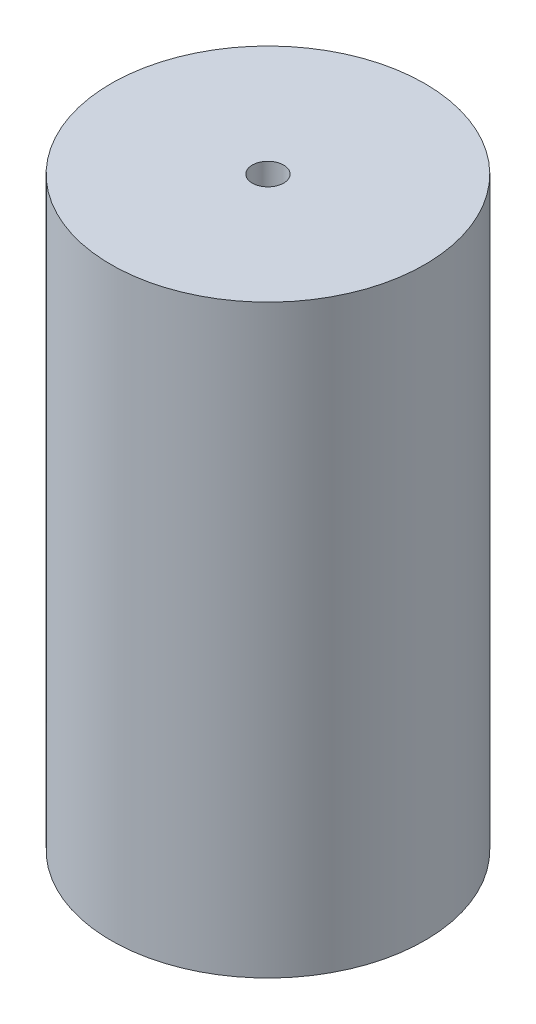
ISO-10303-21;
HEADER;
FILE_DESCRIPTION(('STEP AP214'),'2;1');
FILE_NAME('part.step','',(''),(''),'','','');
FILE_SCHEMA(('AUTOMOTIVE_DESIGN { 1 0 10303 214 1 1 1 1 }'));
ENDSEC;
DATA;
#1=APPLICATION_CONTEXT('core data for automotive mechanical design processes');
#2=APPLICATION_PROTOCOL_DEFINITION('international standard','automotive_design',2000,#1);
#3=PRODUCT_CONTEXT('',#1,'mechanical');
#4=PRODUCT('Part','Part','',(#3));
#5=PRODUCT_RELATED_PRODUCT_CATEGORY('part','',(#4));
#6=PRODUCT_DEFINITION_FORMATION('','',#4);
#7=PRODUCT_DEFINITION_CONTEXT('part definition',#1,'design');
#8=PRODUCT_DEFINITION('design','',#6,#7);
#9=PRODUCT_DEFINITION_SHAPE('','',#8);
#10=(LENGTH_UNIT() NAMED_UNIT(*) SI_UNIT(.MILLI.,.METRE.));
#11=(NAMED_UNIT(*) PLANE_ANGLE_UNIT() SI_UNIT($,.RADIAN.));
#12=(NAMED_UNIT(*) SI_UNIT($,.STERADIAN.) SOLID_ANGLE_UNIT());
#13=UNCERTAINTY_MEASURE_WITH_UNIT(LENGTH_MEASURE(1.E-05),#10,'distance_accuracy_value','');
#14=(GEOMETRIC_REPRESENTATION_CONTEXT(3) GLOBAL_UNCERTAINTY_ASSIGNED_CONTEXT((#13)) GLOBAL_UNIT_ASSIGNED_CONTEXT((#10,
#11,#12)) REPRESENTATION_CONTEXT('',''));
#15=CARTESIAN_POINT('',(0.,0.,0.));
#16=DIRECTION('',(0.,0.,1.));
#17=DIRECTION('',(1.,0.,0.));
#18=AXIS2_PLACEMENT_3D('',#15,#16,#17);
#19=CARTESIAN_POINT('',(0.,0.,0.));
#20=DIRECTION('',(0.,1.,0.));
#21=DIRECTION('',(0.,0.,1.));
#22=AXIS2_PLACEMENT_3D('',#19,#20,#21);
#23=PLANE('',#22);
#24=CARTESIAN_POINT('',(0.,0.,0.));
#25=DIRECTION('',(0.,1.,0.));
#26=DIRECTION('',(0.,0.,1.));
#27=AXIS2_PLACEMENT_3D('',#24,#25,#26);
#28=CIRCLE('',#27,21.717);
#29=CARTESIAN_POINT('',(0.,0.,21.717));
#30=VERTEX_POINT('',#29);
#31=EDGE_CURVE('E49',#30,#30,#28,.T.);
#32=ORIENTED_EDGE('',*,*,#31,.T.);
#33=EDGE_LOOP('',(#32));
#34=FACE_BOUND('',#33,.T.);
#35=CARTESIAN_POINT('',(0.,0.,0.));
#36=DIRECTION('',(0.,1.,0.));
#37=DIRECTION('',(0.,0.,1.));
#38=AXIS2_PLACEMENT_3D('',#35,#36,#37);
#39=CIRCLE('',#38,25.527);
#40=CARTESIAN_POINT('',(0.,0.,-25.527));
#41=VERTEX_POINT('',#40);
#42=EDGE_CURVE('E54',#41,#41,#39,.T.);
#43=ORIENTED_EDGE('',*,*,#42,.F.);
#44=EDGE_LOOP('',(#43));
#45=FACE_BOUND('',#44,.T.);
#46=ADVANCED_FACE('F41',(#34,#45),#23,.F.);
#47=CARTESIAN_POINT('',(0.,76.2,0.));
#48=DIRECTION('',(0.,-1.,0.));
#49=DIRECTION('',(0.,0.,-1.));
#50=AXIS2_PLACEMENT_3D('',#47,#48,#49);
#51=CYLINDRICAL_SURFACE('',#50,25.527);
#52=CARTESIAN_POINT('',(0.,95.25,0.));
#53=DIRECTION('',(0.,1.,0.));
#54=DIRECTION('',(0.,0.,1.));
#55=AXIS2_PLACEMENT_3D('',#52,#53,#54);
#56=CIRCLE('',#55,25.527);
#57=CARTESIAN_POINT('',(0.,95.25,-25.527));
#58=VERTEX_POINT('',#57);
#59=EDGE_CURVE('E65',#58,#58,#56,.T.);
#60=CARTESIAN_POINT('',(0.,0.,-25.527));
#61=CARTESIAN_POINT('',(0.,0.992187500000001,-25.527));
#62=CARTESIAN_POINT('',(0.,1.984375,-25.527));
#63=CARTESIAN_POINT('',(0.,3.96875,-25.527));
#64=CARTESIAN_POINT('',(0.,4.9609375,-25.527));
#65=CARTESIAN_POINT('',(0.,6.9453125,-25.527));
#66=CARTESIAN_POINT('',(0.,7.93750000000001,-25.527));
#67=CARTESIAN_POINT('',(0.,9.92187500000001,-25.527));
#68=CARTESIAN_POINT('',(0.,10.9140625,-25.527));
#69=CARTESIAN_POINT('',(0.,12.8984375,-25.527));
#70=CARTESIAN_POINT('',(0.,13.890625,-25.527));
#71=CARTESIAN_POINT('',(0.,15.875,-25.527));
#72=CARTESIAN_POINT('',(0.,16.8671875,-25.527));
#73=CARTESIAN_POINT('',(0.,18.8515625,-25.527));
#74=CARTESIAN_POINT('',(0.,19.84375,-25.527));
#75=CARTESIAN_POINT('',(0.,21.828125,-25.527));
#76=CARTESIAN_POINT('',(0.,22.8203125,-25.527));
#77=CARTESIAN_POINT('',(0.,24.8046875,-25.527));
#78=CARTESIAN_POINT('',(0.,25.796875,-25.527));
#79=CARTESIAN_POINT('',(0.,27.78125,-25.527));
#80=CARTESIAN_POINT('',(0.,28.7734375,-25.527));
#81=CARTESIAN_POINT('',(0.,30.7578125,-25.527));
#82=CARTESIAN_POINT('',(0.,31.75,-25.527));
#83=CARTESIAN_POINT('',(0.,33.734375,-25.527));
#84=CARTESIAN_POINT('',(0.,34.7265625,-25.527));
#85=CARTESIAN_POINT('',(0.,36.7109375,-25.527));
#86=CARTESIAN_POINT('',(0.,37.703125,-25.527));
#87=CARTESIAN_POINT('',(0.,39.6875,-25.527));
#88=CARTESIAN_POINT('',(0.,40.6796875,-25.527));
#89=CARTESIAN_POINT('',(0.,42.6640625,-25.527));
#90=CARTESIAN_POINT('',(0.,43.65625,-25.527));
#91=CARTESIAN_POINT('',(0.,45.640625,-25.527));
#92=CARTESIAN_POINT('',(0.,46.6328125,-25.527));
#93=CARTESIAN_POINT('',(0.,48.6171875,-25.527));
#94=CARTESIAN_POINT('',(0.,49.609375,-25.527));
#95=CARTESIAN_POINT('',(0.,51.59375,-25.527));
#96=CARTESIAN_POINT('',(0.,52.5859375,-25.527));
#97=CARTESIAN_POINT('',(0.,54.5703125,-25.527));
#98=CARTESIAN_POINT('',(0.,55.5625,-25.527));
#99=CARTESIAN_POINT('',(0.,57.546875,-25.527));
#100=CARTESIAN_POINT('',(0.,58.5390625,-25.527));
#101=CARTESIAN_POINT('',(0.,60.5234375,-25.527));
#102=CARTESIAN_POINT('',(0.,61.515625,-25.527));
#103=CARTESIAN_POINT('',(0.,63.5,-25.527));
#104=CARTESIAN_POINT('',(0.,64.4921875,-25.527));
#105=CARTESIAN_POINT('',(0.,66.4765625,-25.527));
#106=CARTESIAN_POINT('',(0.,67.46875,-25.527));
#107=CARTESIAN_POINT('',(0.,69.453125,-25.527));
#108=CARTESIAN_POINT('',(0.,70.4453125,-25.527));
#109=CARTESIAN_POINT('',(0.,72.4296875,-25.527));
#110=CARTESIAN_POINT('',(0.,73.421875,-25.527));
#111=CARTESIAN_POINT('',(0.,75.40625,-25.527));
#112=CARTESIAN_POINT('',(0.,76.3984375,-25.527));
#113=CARTESIAN_POINT('',(0.,78.3828125,-25.527));
#114=CARTESIAN_POINT('',(0.,79.375,-25.527));
#115=CARTESIAN_POINT('',(0.,81.359375,-25.527));
#116=CARTESIAN_POINT('',(0.,82.3515625,-25.527));
#117=CARTESIAN_POINT('',(0.,84.3359375,-25.527));
#118=CARTESIAN_POINT('',(0.,85.328125,-25.527));
#119=CARTESIAN_POINT('',(0.,87.3125,-25.527));
#120=CARTESIAN_POINT('',(0.,88.3046875,-25.527));
#121=CARTESIAN_POINT('',(0.,90.2890625,-25.527));
#122=CARTESIAN_POINT('',(0.,91.28125,-25.527));
#123=CARTESIAN_POINT('',(0.,93.265625,-25.527));
#124=CARTESIAN_POINT('',(0.,94.2578125,-25.527));
#125=CARTESIAN_POINT('',(0.,95.25,-25.527));
#126=B_SPLINE_CURVE_WITH_KNOTS('',3,(#60,#61,#62,#63,#64,#65,#66,#67,#68,#69,#70,#71,#72,#73,
#74,#75,#76,#77,#78,#79,#80,#81,#82,#83,#84,#85,#86,#87,#88,#89,#90,#91,#92,#93,#94,#95,#96,#97,
#98,#99,#100,#101,#102,#103,#104,#105,#106,#107,#108,#109,#110,#111,#112,#113,#114,#115,#116,
#117,#118,#119,#120,#121,#122,#123,#124,#125),.UNSPECIFIED.,.F.,.F.,(4,2,2,2,2,2,2,2,2,2,2,2,2,
2,2,2,2,2,2,2,2,2,2,2,2,2,2,2,2,2,2,2,4),(0.,2.9765625,5.953125,8.92968750000001,11.90625,
14.8828125,17.859375,20.8359375,23.8125,26.7890625,29.765625,32.7421875,35.71875,38.6953125,
41.671875,44.6484375,47.625,50.6015625,53.578125,56.5546875,59.53125,62.5078125,65.484375,
68.4609375,71.4375,74.4140625,77.390625,80.3671875,83.34375,86.3203125,89.296875,92.2734375,
95.25),.UNSPECIFIED.);
#127=EDGE_CURVE('BSEAM87',#41,#58,#126,.T.);
#128=ORIENTED_EDGE('',*,*,#42,.T.);
#129=ORIENTED_EDGE('',*,*,#59,.F.);
#130=ORIENTED_EDGE('',*,*,#127,.T.);
#131=ORIENTED_EDGE('',*,*,#127,.F.);
#132=EDGE_LOOP('',(#128,#130,#129,#131));
#133=FACE_BOUND('',#132,.T.);
#134=ADVANCED_FACE('F87',(#133),#51,.T.);
#135=CARTESIAN_POINT('',(0.,76.2,0.));
#136=DIRECTION('',(0.,-1.,0.));
#137=DIRECTION('',(0.,0.,-1.));
#138=AXIS2_PLACEMENT_3D('',#135,#136,#137);
#139=CYLINDRICAL_SURFACE('',#138,19.177);
#140=CARTESIAN_POINT('',(0.,2.54,0.));
#141=DIRECTION('',(0.,1.,0.));
#142=DIRECTION('',(0.,0.,1.));
#143=AXIS2_PLACEMENT_3D('',#140,#141,#142);
#144=CIRCLE('',#143,19.177);
#145=CARTESIAN_POINT('',(0.,2.53999999999999,-19.177));
#146=VERTEX_POINT('',#145);
#147=EDGE_CURVE('E10',#146,#146,#144,.F.);
#148=CARTESIAN_POINT('',(0.,76.2,0.));
#149=DIRECTION('',(0.,1.,0.));
#150=DIRECTION('',(0.,0.,1.));
#151=AXIS2_PLACEMENT_3D('',#148,#149,#150);
#152=CIRCLE('',#151,19.177);
#153=CARTESIAN_POINT('',(0.,76.2,-19.177));
#154=VERTEX_POINT('',#153);
#155=EDGE_CURVE('E59',#154,#154,#152,.T.);
#156=CARTESIAN_POINT('',(0.,2.53999999999999,-19.177));
#157=CARTESIAN_POINT('',(0.,3.30729166666665,-19.177));
#158=CARTESIAN_POINT('',(0.,4.07458333333332,-19.177));
#159=CARTESIAN_POINT('',(0.,5.60916666666665,-19.177));
#160=CARTESIAN_POINT('',(0.,6.37645833333332,-19.177));
#161=CARTESIAN_POINT('',(0.,7.91104166666666,-19.177));
#162=CARTESIAN_POINT('',(0.,8.67833333333332,-19.177));
#163=CARTESIAN_POINT('',(0.,10.2129166666667,-19.177));
#164=CARTESIAN_POINT('',(0.,10.9802083333333,-19.177));
#165=CARTESIAN_POINT('',(0.,12.5147916666667,-19.177));
#166=CARTESIAN_POINT('',(0.,13.2820833333333,-19.177));
#167=CARTESIAN_POINT('',(0.,14.8166666666667,-19.177));
#168=CARTESIAN_POINT('',(0.,15.5839583333333,-19.177));
#169=CARTESIAN_POINT('',(0.,17.1185416666667,-19.177));
#170=CARTESIAN_POINT('',(0.,17.8858333333333,-19.177));
#171=CARTESIAN_POINT('',(0.,19.4204166666667,-19.177));
#172=CARTESIAN_POINT('',(0.,20.1877083333333,-19.177));
#173=CARTESIAN_POINT('',(0.,21.7222916666666,-19.177));
#174=CARTESIAN_POINT('',(0.,22.4895833333333,-19.177));
#175=CARTESIAN_POINT('',(0.,24.0241666666667,-19.177));
#176=CARTESIAN_POINT('',(0.,24.7914583333333,-19.177));
#177=CARTESIAN_POINT('',(0.,26.3260416666667,-19.177));
#178=CARTESIAN_POINT('',(0.,27.0933333333333,-19.177));
#179=CARTESIAN_POINT('',(0.,28.6279166666667,-19.177));
#180=CARTESIAN_POINT('',(0.,29.3952083333333,-19.177));
#181=CARTESIAN_POINT('',(0.,30.9297916666667,-19.177));
#182=CARTESIAN_POINT('',(0.,31.6970833333333,-19.177));
#183=CARTESIAN_POINT('',(0.,33.2316666666667,-19.177));
#184=CARTESIAN_POINT('',(0.,33.9989583333333,-19.177));
#185=CARTESIAN_POINT('',(0.,35.5335416666667,-19.177));
#186=CARTESIAN_POINT('',(0.,36.3008333333333,-19.177));
#187=CARTESIAN_POINT('',(0.,37.8354166666667,-19.177));
#188=CARTESIAN_POINT('',(0.,38.6027083333333,-19.177));
#189=CARTESIAN_POINT('',(0.,40.1372916666667,-19.177));
#190=CARTESIAN_POINT('',(0.,40.9045833333333,-19.177));
#191=CARTESIAN_POINT('',(0.,42.4391666666667,-19.177));
#192=CARTESIAN_POINT('',(0.,43.2064583333333,-19.177));
#193=CARTESIAN_POINT('',(0.,44.7410416666667,-19.177));
#194=CARTESIAN_POINT('',(0.,45.5083333333333,-19.177));
#195=CARTESIAN_POINT('',(0.,47.0429166666666,-19.177));
#196=CARTESIAN_POINT('',(0.,47.8102083333333,-19.177));
#197=CARTESIAN_POINT('',(0.,49.3447916666667,-19.177));
#198=CARTESIAN_POINT('',(0.,50.1120833333333,-19.177));
#199=CARTESIAN_POINT('',(0.,51.6466666666667,-19.177));
#200=CARTESIAN_POINT('',(0.,52.4139583333333,-19.177));
#201=CARTESIAN_POINT('',(0.,53.9485416666667,-19.177));
#202=CARTESIAN_POINT('',(0.,54.7158333333333,-19.177));
#203=CARTESIAN_POINT('',(0.,56.2504166666667,-19.177));
#204=CARTESIAN_POINT('',(0.,57.0177083333333,-19.177));
#205=CARTESIAN_POINT('',(0.,58.5522916666667,-19.177));
#206=CARTESIAN_POINT('',(0.,59.3195833333333,-19.177));
#207=CARTESIAN_POINT('',(0.,60.8541666666667,-19.177));
#208=CARTESIAN_POINT('',(0.,61.6214583333333,-19.177));
#209=CARTESIAN_POINT('',(0.,63.1560416666666,-19.177));
#210=CARTESIAN_POINT('',(0.,63.9233333333333,-19.177));
#211=CARTESIAN_POINT('',(0.,65.4579166666667,-19.177));
#212=CARTESIAN_POINT('',(0.,66.2252083333333,-19.177));
#213=CARTESIAN_POINT('',(0.,67.7597916666667,-19.177));
#214=CARTESIAN_POINT('',(0.,68.5270833333333,-19.177));
#215=CARTESIAN_POINT('',(0.,70.0616666666667,-19.177));
#216=CARTESIAN_POINT('',(0.,70.8289583333333,-19.177));
#217=CARTESIAN_POINT('',(0.,72.3635416666667,-19.177));
#218=CARTESIAN_POINT('',(0.,73.1308333333333,-19.177));
#219=CARTESIAN_POINT('',(0.,74.6654166666667,-19.177));
#220=CARTESIAN_POINT('',(0.,75.4327083333333,-19.177));
#221=CARTESIAN_POINT('',(0.,76.2,-19.177));
#222=B_SPLINE_CURVE_WITH_KNOTS('',3,(#156,#157,#158,#159,#160,#161,#162,#163,#164,#165,#166,
#167,#168,#169,#170,#171,#172,#173,#174,#175,#176,#177,#178,#179,#180,#181,#182,#183,#184,#185,
#186,#187,#188,#189,#190,#191,#192,#193,#194,#195,#196,#197,#198,#199,#200,#201,#202,#203,#204,
#205,#206,#207,#208,#209,#210,#211,#212,#213,#214,#215,#216,#217,#218,#219,#220,#221),
.UNSPECIFIED.,.F.,.F.,(4,2,2,2,2,2,2,2,2,2,2,2,2,2,2,2,2,2,2,2,2,2,2,2,2,2,2,2,2,2,2,2,4),(0.,
2.301875,4.60375,6.905625,9.20750000000001,11.509375,13.81125,16.113125,18.415,20.716875,
23.01875,25.320625,27.6225,29.924375,32.22625,34.528125,36.83,39.131875,41.43375,43.735625,
46.0375,48.339375,50.64125,52.943125,55.245,57.546875,59.84875,62.150625,64.4525,66.754375,
69.05625,71.358125,73.66),.UNSPECIFIED.);
#223=EDGE_CURVE('BSEAM89',#146,#154,#222,.T.);
#224=ORIENTED_EDGE('',*,*,#147,.T.);
#225=ORIENTED_EDGE('',*,*,#155,.T.);
#226=ORIENTED_EDGE('',*,*,#223,.T.);
#227=ORIENTED_EDGE('',*,*,#223,.F.);
#228=EDGE_LOOP('',(#224,#226,#225,#227));
#229=FACE_BOUND('',#228,.T.);
#230=ADVANCED_FACE('F89',(#229),#139,.F.);
#231=CARTESIAN_POINT('',(0.,76.2,0.));
#232=DIRECTION('',(0.,1.,0.));
#233=DIRECTION('',(0.,0.,1.));
#234=AXIS2_PLACEMENT_3D('',#231,#232,#233);
#235=PLANE('',#234);
#236=CARTESIAN_POINT('',(0.,76.2,0.));
#237=DIRECTION('',(0.,1.,0.));
#238=DIRECTION('',(0.,0.,1.));
#239=AXIS2_PLACEMENT_3D('',#236,#237,#238);
#240=CIRCLE('',#239,2.55269999999999);
#241=CARTESIAN_POINT('',(0.,76.2,2.55269999999999));
#242=VERTEX_POINT('',#241);
#243=EDGE_CURVE('E69',#242,#242,#240,.T.);
#244=ORIENTED_EDGE('',*,*,#243,.T.);
#245=EDGE_LOOP('',(#244));
#246=FACE_BOUND('',#245,.T.);
#247=ORIENTED_EDGE('',*,*,#155,.F.);
#248=EDGE_LOOP('',(#247));
#249=FACE_BOUND('',#248,.T.);
#250=ADVANCED_FACE('F83',(#246,#249),#235,.F.);
#251=CARTESIAN_POINT('',(0.,95.25,0.));
#252=DIRECTION('',(0.,1.,0.));
#253=DIRECTION('',(0.,0.,1.));
#254=AXIS2_PLACEMENT_3D('',#251,#252,#253);
#255=PLANE('',#254);
#256=CARTESIAN_POINT('',(0.,95.25,0.));
#257=DIRECTION('',(0.,1.,0.));
#258=DIRECTION('',(0.,0.,1.));
#259=AXIS2_PLACEMENT_3D('',#256,#257,#258);
#260=CIRCLE('',#259,2.55269999999999);
#261=CARTESIAN_POINT('',(0.,95.25,2.55269999999999));
#262=VERTEX_POINT('',#261);
#263=EDGE_CURVE('E73',#262,#262,#260,.T.);
#264=ORIENTED_EDGE('',*,*,#263,.F.);
#265=EDGE_LOOP('',(#264));
#266=FACE_BOUND('',#265,.T.);
#267=ORIENTED_EDGE('',*,*,#59,.T.);
#268=EDGE_LOOP('',(#267));
#269=FACE_BOUND('',#268,.T.);
#270=ADVANCED_FACE('F80',(#266,#269),#255,.T.);
#271=CARTESIAN_POINT('',(0.,95.25,0.));
#272=DIRECTION('',(0.,1.,0.));
#273=DIRECTION('',(0.,0.,1.));
#274=AXIS2_PLACEMENT_3D('',#271,#272,#273);
#275=CYLINDRICAL_SURFACE('',#274,2.55269999999999);
#276=ORIENTED_EDGE('',*,*,#243,.F.);
#277=EDGE_LOOP('',(#276));
#278=FACE_BOUND('',#277,.T.);
#279=ORIENTED_EDGE('',*,*,#263,.T.);
#280=EDGE_LOOP('',(#279));
#281=FACE_BOUND('',#280,.T.);
#282=ADVANCED_FACE('F78',(#278,#281),#275,.F.);
#283=CARTESIAN_POINT('',(0.,2.54,0.));
#284=DIRECTION('',(0.,1.,0.));
#285=DIRECTION('',(0.,0.,1.));
#286=AXIS2_PLACEMENT_3D('',#283,#284,#285);
#287=TOROIDAL_SURFACE('',#286,21.717,2.54);
#288=ORIENTED_EDGE('',*,*,#147,.F.);
#289=EDGE_LOOP('',(#288));
#290=FACE_BOUND('',#289,.T.);
#291=ORIENTED_EDGE('',*,*,#31,.F.);
#292=EDGE_LOOP('',(#291));
#293=FACE_BOUND('',#292,.T.);
#294=ADVANCED_FACE('F43',(#290,#293),#287,.T.);
#295=CLOSED_SHELL('',(#46,#134,#230,#250,#270,#282,#294));
#296=MANIFOLD_SOLID_BREP('B2',#295);
#297=ADVANCED_BREP_SHAPE_REPRESENTATION('',(#18,#296),#14);
#298=SHAPE_DEFINITION_REPRESENTATION(#9,#297);
ENDSEC;
END-ISO-10303-21;
